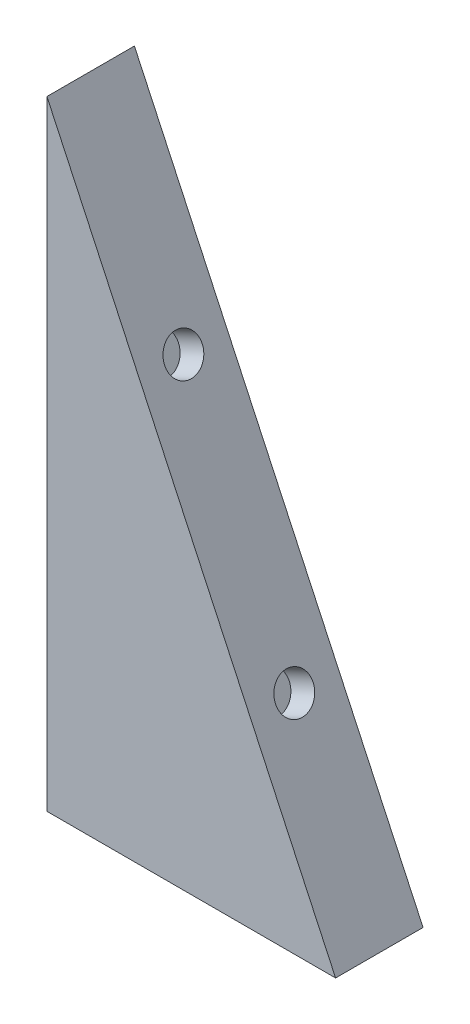
ISO-10303-21;
HEADER;
FILE_DESCRIPTION(('STEP AP214'),'2;1');
FILE_NAME('part.step','',(''),(''),'','','');
FILE_SCHEMA(('AUTOMOTIVE_DESIGN { 1 0 10303 214 1 1 1 1 }'));
ENDSEC;
DATA;
#1=APPLICATION_CONTEXT('core data for automotive mechanical design processes');
#2=APPLICATION_PROTOCOL_DEFINITION('international standard','automotive_design',2000,#1);
#3=PRODUCT_CONTEXT('',#1,'mechanical');
#4=PRODUCT('Part','Part','',(#3));
#5=PRODUCT_RELATED_PRODUCT_CATEGORY('part','',(#4));
#6=PRODUCT_DEFINITION_FORMATION('','',#4);
#7=PRODUCT_DEFINITION_CONTEXT('part definition',#1,'design');
#8=PRODUCT_DEFINITION('design','',#6,#7);
#9=PRODUCT_DEFINITION_SHAPE('','',#8);
#10=(LENGTH_UNIT() NAMED_UNIT(*) SI_UNIT(.MILLI.,.METRE.));
#11=(NAMED_UNIT(*) PLANE_ANGLE_UNIT() SI_UNIT($,.RADIAN.));
#12=(NAMED_UNIT(*) SI_UNIT($,.STERADIAN.) SOLID_ANGLE_UNIT());
#13=UNCERTAINTY_MEASURE_WITH_UNIT(LENGTH_MEASURE(1.E-05),#10,'distance_accuracy_value','');
#14=(GEOMETRIC_REPRESENTATION_CONTEXT(3) GLOBAL_UNCERTAINTY_ASSIGNED_CONTEXT((#13)) GLOBAL_UNIT_ASSIGNED_CONTEXT((#10,
#11,#12)) REPRESENTATION_CONTEXT('',''));
#15=CARTESIAN_POINT('',(0.,0.,0.));
#16=DIRECTION('',(0.,0.,1.));
#17=DIRECTION('',(1.,0.,0.));
#18=AXIS2_PLACEMENT_3D('',#15,#16,#17);
#19=CARTESIAN_POINT('',(0.,0.,10.));
#20=DIRECTION('',(0.,1.,0.));
#21=DIRECTION('',(0.,0.,1.));
#22=AXIS2_PLACEMENT_3D('',#19,#20,#21);
#23=PLANE('',#22);
#24=CARTESIAN_POINT('',(23.331538290775,0.,3.99999999999998));
#25=DIRECTION('',(0.,-1.,0.));
#26=DIRECTION('',(1.,0.,0.));
#27=AXIS2_PLACEMENT_3D('',#24,#25,#26);
#28=CIRCLE('',#27,2.15);
#29=CARTESIAN_POINT('',(25.481538290775,0.,3.99999999999998));
#30=VERTEX_POINT('',#29);
#31=EDGE_CURVE('E346',#30,#30,#28,.T.);
#32=ORIENTED_EDGE('',*,*,#31,.F.);
#33=EDGE_LOOP('',(#32));
#34=FACE_BOUND('',#33,.T.);
#35=CARTESIAN_POINT('',(8.55153829077501,0.,3.99999999999998));
#36=DIRECTION('',(0.,-1.,0.));
#37=DIRECTION('',(1.,0.,0.));
#38=AXIS2_PLACEMENT_3D('',#35,#36,#37);
#39=CIRCLE('',#38,2.15);
#40=CARTESIAN_POINT('',(10.701538290775,0.,3.99999999999998));
#41=VERTEX_POINT('',#40);
#42=EDGE_CURVE('E352',#41,#41,#39,.T.);
#43=ORIENTED_EDGE('',*,*,#42,.F.);
#44=EDGE_LOOP('',(#43));
#45=FACE_BOUND('',#44,.T.);
#46=DIRECTION('',(1.,0.,0.));
#47=VECTOR('',#46,1.);
#48=CARTESIAN_POINT('',(0.,0.,0.));
#49=LINE('',#48,#47);
#50=CARTESIAN_POINT('',(0.,0.,0.));
#51=VERTEX_POINT('',#50);
#52=CARTESIAN_POINT('',(33.,0.,0.));
#53=VERTEX_POINT('',#52);
#54=EDGE_CURVE('E393',#51,#53,#49,.T.);
#55=ORIENTED_EDGE('',*,*,#54,.T.);
#56=DIRECTION('',(0.,0.,-1.));
#57=VECTOR('',#56,1.);
#58=CARTESIAN_POINT('',(33.,0.,10.));
#59=LINE('',#58,#57);
#60=CARTESIAN_POINT('',(33.,0.,10.));
#61=VERTEX_POINT('',#60);
#62=EDGE_CURVE('E397',#61,#53,#59,.T.);
#63=ORIENTED_EDGE('',*,*,#62,.F.);
#64=DIRECTION('',(1.,0.,0.));
#65=VECTOR('',#64,1.);
#66=CARTESIAN_POINT('',(0.,0.,10.));
#67=LINE('',#66,#65);
#68=CARTESIAN_POINT('',(0.,0.,10.));
#69=VERTEX_POINT('',#68);
#70=EDGE_CURVE('E395',#69,#61,#67,.T.);
#71=ORIENTED_EDGE('',*,*,#70,.F.);
#72=DIRECTION('',(0.,0.,-1.));
#73=VECTOR('',#72,1.);
#74=CARTESIAN_POINT('',(0.,0.,10.));
#75=LINE('',#74,#73);
#76=EDGE_CURVE('E43',#69,#51,#75,.T.);
#77=ORIENTED_EDGE('',*,*,#76,.T.);
#78=EDGE_LOOP('',(#55,#63,#71,#77));
#79=FACE_BOUND('',#78,.T.);
#80=DIRECTION('',(0.,0.,1.));
#81=VECTOR('',#80,1.);
#82=CARTESIAN_POINT('',(19.4,0.,6.9));
#83=LINE('',#82,#81);
#84=CARTESIAN_POINT('',(19.4,0.,3.1));
#85=VERTEX_POINT('',#84);
#86=CARTESIAN_POINT('',(19.4,0.,6.9));
#87=VERTEX_POINT('',#86);
#88=EDGE_CURVE('E345',#85,#87,#83,.T.);
#89=ORIENTED_EDGE('',*,*,#88,.F.);
#90=DIRECTION('',(1.,0.,0.));
#91=VECTOR('',#90,1.);
#92=CARTESIAN_POINT('',(13.6,0.,3.1));
#93=LINE('',#92,#91);
#94=CARTESIAN_POINT('',(13.6,0.,3.1));
#95=VERTEX_POINT('',#94);
#96=EDGE_CURVE('E360',#95,#85,#93,.T.);
#97=ORIENTED_EDGE('',*,*,#96,.F.);
#98=DIRECTION('',(0.,0.,-1.));
#99=VECTOR('',#98,1.);
#100=CARTESIAN_POINT('',(13.6,0.,6.9));
#101=LINE('',#100,#99);
#102=CARTESIAN_POINT('',(13.6,0.,6.9));
#103=VERTEX_POINT('',#102);
#104=EDGE_CURVE('E372',#103,#95,#101,.T.);
#105=ORIENTED_EDGE('',*,*,#104,.F.);
#106=DIRECTION('',(-1.,0.,0.));
#107=VECTOR('',#106,1.);
#108=CARTESIAN_POINT('',(13.6,0.,6.9));
#109=LINE('',#108,#107);
#110=EDGE_CURVE('E369',#87,#103,#109,.T.);
#111=ORIENTED_EDGE('',*,*,#110,.F.);
#112=EDGE_LOOP('',(#89,#97,#105,#111));
#113=FACE_BOUND('',#112,.T.);
#114=ADVANCED_FACE('F34',(#34,#45,#79,#113),#23,.F.);
#115=CARTESIAN_POINT('',(33.,0.,10.));
#116=DIRECTION('',(-0.906307787036648,-0.422618261740704,0.));
#117=DIRECTION('',(0.422618261740704,-0.906307787036648,0.));
#118=AXIS2_PLACEMENT_3D('',#115,#116,#117);
#119=PLANE('',#118);
#120=CARTESIAN_POINT('',(23.2797799799638,20.8450791018429,5.));
#121=DIRECTION('',(0.906307787036648,0.422618261740704,0.));
#122=DIRECTION('',(-0.422618261740704,0.906307787036648,0.));
#123=AXIS2_PLACEMENT_3D('',#120,#121,#122);
#124=CIRCLE('',#123,2.15);
#125=CARTESIAN_POINT('',(22.3711507172213,22.7936408439717,5.));
#126=VERTEX_POINT('',#125);
#127=EDGE_CURVE('E299',#126,#126,#124,.T.);
#128=ORIENTED_EDGE('',*,*,#127,.F.);
#129=EDGE_LOOP('',(#128));
#130=FACE_BOUND('',#129,.T.);
#131=CARTESIAN_POINT('',(10.6012321277427,48.0343127129423,5.));
#132=DIRECTION('',(0.906307787036648,0.422618261740704,0.));
#133=DIRECTION('',(-0.422618261740704,0.906307787036648,0.));
#134=AXIS2_PLACEMENT_3D('',#131,#132,#133);
#135=CIRCLE('',#134,2.15);
#136=CARTESIAN_POINT('',(9.69260286500018,49.9828744550711,5.));
#137=VERTEX_POINT('',#136);
#138=EDGE_CURVE('E305',#137,#137,#135,.T.);
#139=ORIENTED_EDGE('',*,*,#138,.F.);
#140=EDGE_LOOP('',(#139));
#141=FACE_BOUND('',#140,.T.);
#142=DIRECTION('',(-0.422618261740704,0.906307787036648,0.));
#143=VECTOR('',#142,1.);
#144=CARTESIAN_POINT('',(33.,0.,0.));
#145=LINE('',#144,#143);
#146=CARTESIAN_POINT('',(0.,70.7687283768145,0.));
#147=VERTEX_POINT('',#146);
#148=EDGE_CURVE('E388',#53,#147,#145,.T.);
#149=ORIENTED_EDGE('',*,*,#148,.T.);
#150=DIRECTION('',(0.,0.,-1.));
#151=VECTOR('',#150,1.);
#152=CARTESIAN_POINT('',(0.,70.7687283768145,10.));
#153=LINE('',#152,#151);
#154=CARTESIAN_POINT('',(0.,70.7687283768145,10.));
#155=VERTEX_POINT('',#154);
#156=EDGE_CURVE('E11',#155,#147,#153,.T.);
#157=ORIENTED_EDGE('',*,*,#156,.F.);
#158=DIRECTION('',(-0.422618261740704,0.906307787036648,0.));
#159=VECTOR('',#158,1.);
#160=CARTESIAN_POINT('',(33.,0.,10.));
#161=LINE('',#160,#159);
#162=EDGE_CURVE('E389',#61,#155,#161,.T.);
#163=ORIENTED_EDGE('',*,*,#162,.F.);
#164=ORIENTED_EDGE('',*,*,#62,.T.);
#165=EDGE_LOOP('',(#149,#157,#163,#164));
#166=FACE_BOUND('',#165,.T.);
#167=ADVANCED_FACE('F36',(#130,#141,#166),#119,.F.);
#168=CARTESIAN_POINT('',(0.,70.7687283768145,10.));
#169=DIRECTION('',(1.,0.,0.));
#170=DIRECTION('',(0.,1.,0.));
#171=AXIS2_PLACEMENT_3D('',#168,#169,#170);
#172=PLANE('',#171);
#173=DIRECTION('',(0.,-1.,0.));
#174=VECTOR('',#173,1.);
#175=CARTESIAN_POINT('',(0.,70.7687283768145,0.));
#176=LINE('',#175,#174);
#177=EDGE_CURVE('E400',#147,#51,#176,.T.);
#178=ORIENTED_EDGE('',*,*,#177,.T.);
#179=ORIENTED_EDGE('',*,*,#76,.F.);
#180=DIRECTION('',(0.,-1.,0.));
#181=VECTOR('',#180,1.);
#182=CARTESIAN_POINT('',(0.,70.7687283768145,10.));
#183=LINE('',#182,#181);
#184=EDGE_CURVE('E392',#155,#69,#183,.T.);
#185=ORIENTED_EDGE('',*,*,#184,.F.);
#186=ORIENTED_EDGE('',*,*,#156,.T.);
#187=EDGE_LOOP('',(#178,#179,#185,#186));
#188=FACE_BOUND('',#187,.T.);
#189=ADVANCED_FACE('F453',(#188),#172,.F.);
#190=CARTESIAN_POINT('',(0.,0.,10.));
#191=DIRECTION('',(0.,0.,-1.));
#192=DIRECTION('',(-1.,0.,0.));
#193=AXIS2_PLACEMENT_3D('',#190,#191,#192);
#194=PLANE('',#193);
#195=ORIENTED_EDGE('',*,*,#162,.T.);
#196=ORIENTED_EDGE('',*,*,#184,.T.);
#197=ORIENTED_EDGE('',*,*,#70,.T.);
#198=EDGE_LOOP('',(#195,#196,#197));
#199=FACE_BOUND('',#198,.T.);
#200=ADVANCED_FACE('F461',(#199),#194,.F.);
#201=CARTESIAN_POINT('',(0.,0.,0.));
#202=DIRECTION('',(0.,0.,-1.));
#203=DIRECTION('',(-1.,0.,0.));
#204=AXIS2_PLACEMENT_3D('',#201,#202,#203);
#205=PLANE('',#204);
#206=DIRECTION('',(-0.430111255691985,0.902775890089597,0.));
#207=VECTOR('',#206,1.);
#208=CARTESIAN_POINT('',(21.6950175173137,10.3361989714915,0.));
#209=LINE('',#208,#207);
#210=CARTESIAN_POINT('',(6.62751953155143,41.9619091232409,0.));
#211=VERTEX_POINT('',#210);
#212=CARTESIAN_POINT('',(3.35867398829233,48.8230058879219,0.));
#213=VERTEX_POINT('',#212);
#214=EDGE_CURVE('E51',#211,#213,#209,.T.);
#215=ORIENTED_EDGE('',*,*,#214,.F.);
#216=DIRECTION('',(-0.902775890089598,-0.430111255691982,0.));
#217=VECTOR('',#216,1.);
#218=CARTESIAN_POINT('',(-15.0674979857622,31.6257101517496,0.));
#219=LINE('',#218,#217);
#220=CARTESIAN_POINT('',(9.51640237983814,43.3382651414553,0.));
#221=VERTEX_POINT('',#220);
#222=EDGE_CURVE('E266',#221,#211,#219,.T.);
#223=ORIENTED_EDGE('',*,*,#222,.F.);
#224=DIRECTION('',(0.430111255691984,-0.902775890089597,0.));
#225=VECTOR('',#224,1.);
#226=CARTESIAN_POINT('',(24.5839003656003,11.7125549897058,0.));
#227=LINE('',#226,#225);
#228=CARTESIAN_POINT('',(6.24755683657904,50.1993619061362,0.));
#229=VERTEX_POINT('',#228);
#230=EDGE_CURVE('E263',#229,#221,#227,.T.);
#231=ORIENTED_EDGE('',*,*,#230,.F.);
#232=DIRECTION('',(0.902775890089598,0.430111255691982,0.));
#233=VECTOR('',#232,1.);
#234=CARTESIAN_POINT('',(-18.3363435290212,38.4868069164305,0.));
#235=LINE('',#234,#233);
#236=EDGE_CURVE('E259',#213,#229,#235,.T.);
#237=ORIENTED_EDGE('',*,*,#236,.F.);
#238=EDGE_LOOP('',(#215,#223,#231,#237));
#239=FACE_BOUND('',#238,.T.);
#240=DIRECTION('',(-0.4150962680394,0.9097774938191,0.));
#241=VECTOR('',#240,1.);
#242=CARTESIAN_POINT('',(21.5006822055188,9.80992935574487,0.));
#243=LINE('',#242,#241);
#244=CARTESIAN_POINT('',(19.2258982592982,14.7956336294728,0.));
#245=VERTEX_POINT('',#244);
#246=CARTESIAN_POINT('',(16.0711666221987,21.7099425824979,0.));
#247=VERTEX_POINT('',#246);
#248=EDGE_CURVE('E59',#245,#247,#243,.T.);
#249=ORIENTED_EDGE('',*,*,#248,.F.);
#250=DIRECTION('',(-0.909777493819097,-0.415096268039407,0.));
#251=VECTOR('',#250,1.);
#252=CARTESIAN_POINT('',(-2.2747839462206,4.98570427372771,0.));
#253=LINE('',#252,#251);
#254=CARTESIAN_POINT('',(22.1371862395193,16.1239416871989,0.));
#255=VERTEX_POINT('',#254);
#256=EDGE_CURVE('E285',#255,#245,#253,.T.);
#257=ORIENTED_EDGE('',*,*,#256,.F.);
#258=DIRECTION('',(0.415096268039401,-0.909777493819099,0.));
#259=VECTOR('',#258,1.);
#260=CARTESIAN_POINT('',(24.4119701857399,11.138237413471,0.));
#261=LINE('',#260,#259);
#262=CARTESIAN_POINT('',(18.9824546024198,23.038250640224,0.));
#263=VERTEX_POINT('',#262);
#264=EDGE_CURVE('E282',#263,#255,#261,.T.);
#265=ORIENTED_EDGE('',*,*,#264,.F.);
#266=DIRECTION('',(0.9097774938191,0.415096268039401,0.));
#267=VECTOR('',#266,1.);
#268=CARTESIAN_POINT('',(-5.42951558332008,11.900013226753,0.));
#269=LINE('',#268,#267);
#270=EDGE_CURVE('E279',#247,#263,#269,.T.);
#271=ORIENTED_EDGE('',*,*,#270,.F.);
#272=EDGE_LOOP('',(#249,#257,#265,#271));
#273=FACE_BOUND('',#272,.T.);
#274=DIRECTION('',(0.,-1.,0.));
#275=VECTOR('',#274,1.);
#276=CARTESIAN_POINT('',(12.351538290775,3.25,0.));
#277=LINE('',#276,#275);
#278=CARTESIAN_POINT('',(12.351538290775,6.75,0.));
#279=VERTEX_POINT('',#278);
#280=CARTESIAN_POINT('',(12.351538290775,3.25,0.));
#281=VERTEX_POINT('',#280);
#282=EDGE_CURVE('E298',#279,#281,#277,.T.);
#283=ORIENTED_EDGE('',*,*,#282,.F.);
#284=DIRECTION('',(1.,0.,0.));
#285=VECTOR('',#284,1.);
#286=CARTESIAN_POINT('',(12.351538290775,6.75,0.));
#287=LINE('',#286,#285);
#288=CARTESIAN_POINT('',(4.75153829077501,6.75,0.));
#289=VERTEX_POINT('',#288);
#290=EDGE_CURVE('E199',#289,#279,#287,.T.);
#291=ORIENTED_EDGE('',*,*,#290,.F.);
#292=DIRECTION('',(0.,1.,0.));
#293=VECTOR('',#292,1.);
#294=CARTESIAN_POINT('',(4.75153829077501,6.75,0.));
#295=LINE('',#294,#293);
#296=CARTESIAN_POINT('',(4.75153829077501,3.25,0.));
#297=VERTEX_POINT('',#296);
#298=EDGE_CURVE('E312',#297,#289,#295,.T.);
#299=ORIENTED_EDGE('',*,*,#298,.F.);
#300=DIRECTION('',(-1.,0.,0.));
#301=VECTOR('',#300,1.);
#302=CARTESIAN_POINT('',(4.75153829077501,3.25,0.));
#303=LINE('',#302,#301);
#304=EDGE_CURVE('E309',#281,#297,#303,.T.);
#305=ORIENTED_EDGE('',*,*,#304,.F.);
#306=EDGE_LOOP('',(#283,#291,#299,#305));
#307=FACE_BOUND('',#306,.T.);
#308=DIRECTION('',(1.,0.,0.));
#309=VECTOR('',#308,1.);
#310=CARTESIAN_POINT('',(0.,6.75000000000001,0.));
#311=LINE('',#310,#309);
#312=CARTESIAN_POINT('',(19.531538290775,6.75,0.));
#313=VERTEX_POINT('',#312);
#314=CARTESIAN_POINT('',(27.131538290775,6.75,0.));
#315=VERTEX_POINT('',#314);
#316=EDGE_CURVE('E320',#313,#315,#311,.T.);
#317=ORIENTED_EDGE('',*,*,#316,.F.);
#318=DIRECTION('',(0.,-1.,0.));
#319=VECTOR('',#318,1.);
#320=CARTESIAN_POINT('',(19.531538290775,0.,0.));
#321=LINE('',#320,#319);
#322=CARTESIAN_POINT('',(19.531538290775,3.25,0.));
#323=VERTEX_POINT('',#322);
#324=EDGE_CURVE('E329',#313,#323,#321,.T.);
#325=ORIENTED_EDGE('',*,*,#324,.T.);
#326=DIRECTION('',(-1.,0.,0.));
#327=VECTOR('',#326,1.);
#328=CARTESIAN_POINT('',(0.,3.25,0.));
#329=LINE('',#328,#327);
#330=CARTESIAN_POINT('',(27.131538290775,3.25,0.));
#331=VERTEX_POINT('',#330);
#332=EDGE_CURVE('E326',#331,#323,#329,.T.);
#333=ORIENTED_EDGE('',*,*,#332,.F.);
#334=DIRECTION('',(0.,-1.,0.));
#335=VECTOR('',#334,1.);
#336=CARTESIAN_POINT('',(27.131538290775,0.,0.));
#337=LINE('',#336,#335);
#338=EDGE_CURVE('E322',#315,#331,#337,.T.);
#339=ORIENTED_EDGE('',*,*,#338,.F.);
#340=EDGE_LOOP('',(#317,#325,#333,#339));
#341=FACE_BOUND('',#340,.T.);
#342=ORIENTED_EDGE('',*,*,#148,.F.);
#343=ORIENTED_EDGE('',*,*,#54,.F.);
#344=ORIENTED_EDGE('',*,*,#177,.F.);
#345=EDGE_LOOP('',(#342,#343,#344));
#346=FACE_BOUND('',#345,.T.);
#347=ADVANCED_FACE('F458',(#239,#273,#307,#341,#346),#205,.T.);
#348=CARTESIAN_POINT('',(19.4,-2.,6.9));
#349=DIRECTION('',(-1.,0.,0.));
#350=DIRECTION('',(0.,-1.,0.));
#351=AXIS2_PLACEMENT_3D('',#348,#349,#350);
#352=PLANE('',#351);
#353=ORIENTED_EDGE('',*,*,#88,.T.);
#354=DIRECTION('',(0.,1.,0.));
#355=VECTOR('',#354,1.);
#356=CARTESIAN_POINT('',(19.4,-2.,6.9));
#357=LINE('',#356,#355);
#358=CARTESIAN_POINT('',(19.4,-2.,6.9));
#359=VERTEX_POINT('',#358);
#360=EDGE_CURVE('E385',#359,#87,#357,.T.);
#361=ORIENTED_EDGE('',*,*,#360,.F.);
#362=DIRECTION('',(0.,0.,1.));
#363=VECTOR('',#362,1.);
#364=CARTESIAN_POINT('',(19.4,-2.,6.9));
#365=LINE('',#364,#363);
#366=CARTESIAN_POINT('',(19.4,-2.,3.1));
#367=VERTEX_POINT('',#366);
#368=EDGE_CURVE('E356',#367,#359,#365,.T.);
#369=ORIENTED_EDGE('',*,*,#368,.F.);
#370=DIRECTION('',(0.,1.,0.));
#371=VECTOR('',#370,1.);
#372=CARTESIAN_POINT('',(19.4,-2.,3.1));
#373=LINE('',#372,#371);
#374=EDGE_CURVE('E366',#367,#85,#373,.T.);
#375=ORIENTED_EDGE('',*,*,#374,.T.);
#376=EDGE_LOOP('',(#353,#361,#369,#375));
#377=FACE_BOUND('',#376,.T.);
#378=ADVANCED_FACE('F479',(#377),#352,.F.);
#379=CARTESIAN_POINT('',(13.6,-2.,6.9));
#380=DIRECTION('',(0.,0.,-1.));
#381=DIRECTION('',(-1.,0.,0.));
#382=AXIS2_PLACEMENT_3D('',#379,#380,#381);
#383=PLANE('',#382);
#384=ORIENTED_EDGE('',*,*,#110,.T.);
#385=DIRECTION('',(0.,1.,0.));
#386=VECTOR('',#385,1.);
#387=CARTESIAN_POINT('',(13.6,-2.,6.9));
#388=LINE('',#387,#386);
#389=CARTESIAN_POINT('',(13.6,-2.,6.9));
#390=VERTEX_POINT('',#389);
#391=EDGE_CURVE('E382',#390,#103,#388,.T.);
#392=ORIENTED_EDGE('',*,*,#391,.F.);
#393=DIRECTION('',(-1.,0.,0.));
#394=VECTOR('',#393,1.);
#395=CARTESIAN_POINT('',(13.6,-2.,6.9));
#396=LINE('',#395,#394);
#397=EDGE_CURVE('E359',#359,#390,#396,.T.);
#398=ORIENTED_EDGE('',*,*,#397,.F.);
#399=ORIENTED_EDGE('',*,*,#360,.T.);
#400=EDGE_LOOP('',(#384,#392,#398,#399));
#401=FACE_BOUND('',#400,.T.);
#402=ADVANCED_FACE('F484',(#401),#383,.F.);
#403=CARTESIAN_POINT('',(13.6,-2.,6.9));
#404=DIRECTION('',(1.,0.,0.));
#405=DIRECTION('',(0.,1.,0.));
#406=AXIS2_PLACEMENT_3D('',#403,#404,#405);
#407=PLANE('',#406);
#408=ORIENTED_EDGE('',*,*,#104,.T.);
#409=DIRECTION('',(0.,1.,0.));
#410=VECTOR('',#409,1.);
#411=CARTESIAN_POINT('',(13.6,-2.,3.1));
#412=LINE('',#411,#410);
#413=CARTESIAN_POINT('',(13.6,-2.,3.1));
#414=VERTEX_POINT('',#413);
#415=EDGE_CURVE('E379',#414,#95,#412,.T.);
#416=ORIENTED_EDGE('',*,*,#415,.F.);
#417=DIRECTION('',(0.,0.,-1.));
#418=VECTOR('',#417,1.);
#419=CARTESIAN_POINT('',(13.6,-2.,6.9));
#420=LINE('',#419,#418);
#421=EDGE_CURVE('E362',#390,#414,#420,.T.);
#422=ORIENTED_EDGE('',*,*,#421,.F.);
#423=ORIENTED_EDGE('',*,*,#391,.T.);
#424=EDGE_LOOP('',(#408,#416,#422,#423));
#425=FACE_BOUND('',#424,.T.);
#426=ADVANCED_FACE('F836',(#425),#407,.F.);
#427=CARTESIAN_POINT('',(13.6,-2.,3.1));
#428=DIRECTION('',(0.,0.,1.));
#429=DIRECTION('',(1.,0.,0.));
#430=AXIS2_PLACEMENT_3D('',#427,#428,#429);
#431=PLANE('',#430);
#432=ORIENTED_EDGE('',*,*,#96,.T.);
#433=ORIENTED_EDGE('',*,*,#374,.F.);
#434=DIRECTION('',(1.,0.,0.));
#435=VECTOR('',#434,1.);
#436=CARTESIAN_POINT('',(13.6,-2.,3.1));
#437=LINE('',#436,#435);
#438=EDGE_CURVE('E364',#414,#367,#437,.T.);
#439=ORIENTED_EDGE('',*,*,#438,.F.);
#440=ORIENTED_EDGE('',*,*,#415,.T.);
#441=EDGE_LOOP('',(#432,#433,#439,#440));
#442=FACE_BOUND('',#441,.T.);
#443=ADVANCED_FACE('F827',(#442),#431,.F.);
#444=CARTESIAN_POINT('',(0.,-2.,0.));
#445=DIRECTION('',(0.,-1.,0.));
#446=DIRECTION('',(1.,0.,0.));
#447=AXIS2_PLACEMENT_3D('',#444,#445,#446);
#448=PLANE('',#447);
#449=ORIENTED_EDGE('',*,*,#368,.T.);
#450=ORIENTED_EDGE('',*,*,#397,.T.);
#451=ORIENTED_EDGE('',*,*,#421,.T.);
#452=ORIENTED_EDGE('',*,*,#438,.T.);
#453=EDGE_LOOP('',(#449,#450,#451,#452));
#454=FACE_BOUND('',#453,.T.);
#455=ADVANCED_FACE('F530',(#454),#448,.T.);
#456=CARTESIAN_POINT('',(8.55153829077501,12.,3.99999999999998));
#457=DIRECTION('',(0.,-1.,0.));
#458=DIRECTION('',(1.,0.,0.));
#459=AXIS2_PLACEMENT_3D('',#456,#457,#458);
#460=CYLINDRICAL_SURFACE('',#459,2.15);
#461=CARTESIAN_POINT('',(8.55153829077501,3.25,3.99999999999998));
#462=DIRECTION('',(0.,-1.,0.));
#463=DIRECTION('',(0.,0.,-1.));
#464=AXIS2_PLACEMENT_3D('',#461,#462,#463);
#465=CIRCLE('',#464,2.15);
#466=CARTESIAN_POINT('',(8.55153829077501,3.25,1.84999999999998));
#467=VERTEX_POINT('',#466);
#468=EDGE_CURVE('E202',#467,#467,#465,.F.);
#469=ORIENTED_EDGE('',*,*,#468,.T.);
#470=EDGE_LOOP('',(#469));
#471=FACE_BOUND('',#470,.T.);
#472=ORIENTED_EDGE('',*,*,#42,.T.);
#473=EDGE_LOOP('',(#472));
#474=FACE_BOUND('',#473,.T.);
#475=ADVANCED_FACE('F522',(#471,#474),#460,.F.);
#476=CARTESIAN_POINT('',(23.331538290775,12.,3.99999999999998));
#477=DIRECTION('',(0.,-1.,0.));
#478=DIRECTION('',(1.,0.,0.));
#479=AXIS2_PLACEMENT_3D('',#476,#477,#478);
#480=CYLINDRICAL_SURFACE('',#479,2.15);
#481=CARTESIAN_POINT('',(23.331538290775,3.25,3.99999999999998));
#482=DIRECTION('',(0.,-1.,0.));
#483=DIRECTION('',(0.,0.,-1.));
#484=AXIS2_PLACEMENT_3D('',#481,#482,#483);
#485=CIRCLE('',#484,2.15);
#486=CARTESIAN_POINT('',(23.331538290775,3.25,1.84999999999998));
#487=VERTEX_POINT('',#486);
#488=EDGE_CURVE('E335',#487,#487,#485,.F.);
#489=ORIENTED_EDGE('',*,*,#488,.T.);
#490=EDGE_LOOP('',(#489));
#491=FACE_BOUND('',#490,.T.);
#492=ORIENTED_EDGE('',*,*,#31,.T.);
#493=EDGE_LOOP('',(#492));
#494=FACE_BOUND('',#493,.T.);
#495=ADVANCED_FACE('F519',(#491,#494),#480,.F.);
#496=CARTESIAN_POINT('',(0.,6.75000000000001,6.5));
#497=DIRECTION('',(0.,1.,0.));
#498=DIRECTION('',(-1.,0.,0.));
#499=AXIS2_PLACEMENT_3D('',#496,#497,#498);
#500=PLANE('',#499);
#501=ORIENTED_EDGE('',*,*,#316,.T.);
#502=DIRECTION('',(0.,0.,-1.));
#503=VECTOR('',#502,1.);
#504=CARTESIAN_POINT('',(27.131538290775,6.75,6.5));
#505=LINE('',#504,#503);
#506=CARTESIAN_POINT('',(27.131538290775,6.75,8.75));
#507=VERTEX_POINT('',#506);
#508=EDGE_CURVE('E332',#507,#315,#505,.T.);
#509=ORIENTED_EDGE('',*,*,#508,.F.);
#510=DIRECTION('',(1.,0.,0.));
#511=VECTOR('',#510,1.);
#512=CARTESIAN_POINT('',(27.131538290775,6.75,8.75));
#513=LINE('',#512,#511);
#514=CARTESIAN_POINT('',(19.531538290775,6.75,8.75));
#515=VERTEX_POINT('',#514);
#516=EDGE_CURVE('E255',#515,#507,#513,.T.);
#517=ORIENTED_EDGE('',*,*,#516,.F.);
#518=DIRECTION('',(0.,0.,-1.));
#519=VECTOR('',#518,1.);
#520=CARTESIAN_POINT('',(19.531538290775,6.75,6.5));
#521=LINE('',#520,#519);
#522=EDGE_CURVE('E333',#515,#313,#521,.T.);
#523=ORIENTED_EDGE('',*,*,#522,.T.);
#524=EDGE_LOOP('',(#501,#509,#517,#523));
#525=FACE_BOUND('',#524,.T.);
#526=CARTESIAN_POINT('',(23.331538290775,6.75,3.99999999999998));
#527=DIRECTION('',(0.,1.,0.));
#528=DIRECTION('',(-1.,0.,0.));
#529=AXIS2_PLACEMENT_3D('',#526,#527,#528);
#530=CIRCLE('',#529,2.15);
#531=CARTESIAN_POINT('',(21.181538290775,6.75,3.99999999999998));
#532=VERTEX_POINT('',#531);
#533=EDGE_CURVE('E355',#532,#532,#530,.F.);
#534=ORIENTED_EDGE('',*,*,#533,.F.);
#535=EDGE_LOOP('',(#534));
#536=FACE_BOUND('',#535,.T.);
#537=ADVANCED_FACE('F500',(#525,#536),#500,.F.);
#538=CARTESIAN_POINT('',(0.,3.25,6.5));
#539=DIRECTION('',(0.,-1.,0.));
#540=DIRECTION('',(0.,0.,-1.));
#541=AXIS2_PLACEMENT_3D('',#538,#539,#540);
#542=PLANE('',#541);
#543=ORIENTED_EDGE('',*,*,#332,.T.);
#544=DIRECTION('',(0.,0.,-1.));
#545=VECTOR('',#544,1.);
#546=CARTESIAN_POINT('',(19.531538290775,3.25,6.5));
#547=LINE('',#546,#545);
#548=CARTESIAN_POINT('',(19.531538290775,3.25,8.75));
#549=VERTEX_POINT('',#548);
#550=EDGE_CURVE('E336',#549,#323,#547,.T.);
#551=ORIENTED_EDGE('',*,*,#550,.F.);
#552=DIRECTION('',(-1.,0.,0.));
#553=VECTOR('',#552,1.);
#554=CARTESIAN_POINT('',(19.531538290775,3.25,8.75));
#555=LINE('',#554,#553);
#556=CARTESIAN_POINT('',(27.131538290775,3.25,8.75));
#557=VERTEX_POINT('',#556);
#558=EDGE_CURVE('E249',#557,#549,#555,.T.);
#559=ORIENTED_EDGE('',*,*,#558,.F.);
#560=DIRECTION('',(0.,0.,-1.));
#561=VECTOR('',#560,1.);
#562=CARTESIAN_POINT('',(27.131538290775,3.25,6.5));
#563=LINE('',#562,#561);
#564=EDGE_CURVE('E338',#557,#331,#563,.T.);
#565=ORIENTED_EDGE('',*,*,#564,.T.);
#566=EDGE_LOOP('',(#543,#551,#559,#565));
#567=FACE_BOUND('',#566,.T.);
#568=ORIENTED_EDGE('',*,*,#488,.F.);
#569=EDGE_LOOP('',(#568));
#570=FACE_BOUND('',#569,.T.);
#571=ADVANCED_FACE('F513',(#567,#570),#542,.F.);
#572=CARTESIAN_POINT('',(19.531538290775,0.,6.5));
#573=DIRECTION('',(1.,0.,0.));
#574=DIRECTION('',(0.,0.,-1.));
#575=AXIS2_PLACEMENT_3D('',#572,#573,#574);
#576=PLANE('',#575);
#577=ORIENTED_EDGE('',*,*,#324,.F.);
#578=ORIENTED_EDGE('',*,*,#522,.F.);
#579=DIRECTION('',(0.,1.,0.));
#580=VECTOR('',#579,1.);
#581=CARTESIAN_POINT('',(19.531538290775,6.75,8.75));
#582=LINE('',#581,#580);
#583=EDGE_CURVE('E252',#549,#515,#582,.T.);
#584=ORIENTED_EDGE('',*,*,#583,.F.);
#585=ORIENTED_EDGE('',*,*,#550,.T.);
#586=EDGE_LOOP('',(#577,#578,#584,#585));
#587=FACE_BOUND('',#586,.T.);
#588=ADVANCED_FACE('F511',(#587),#576,.T.);
#589=CARTESIAN_POINT('',(27.131538290775,0.,6.5));
#590=DIRECTION('',(1.,0.,0.));
#591=DIRECTION('',(0.,0.,-1.));
#592=AXIS2_PLACEMENT_3D('',#589,#590,#591);
#593=PLANE('',#592);
#594=ORIENTED_EDGE('',*,*,#338,.T.);
#595=ORIENTED_EDGE('',*,*,#564,.F.);
#596=DIRECTION('',(0.,-1.,0.));
#597=VECTOR('',#596,1.);
#598=CARTESIAN_POINT('',(27.131538290775,3.25,8.75));
#599=LINE('',#598,#597);
#600=EDGE_CURVE('E226',#507,#557,#599,.T.);
#601=ORIENTED_EDGE('',*,*,#600,.F.);
#602=ORIENTED_EDGE('',*,*,#508,.T.);
#603=EDGE_LOOP('',(#594,#595,#601,#602));
#604=FACE_BOUND('',#603,.T.);
#605=ADVANCED_FACE('F505',(#604),#593,.F.);
#606=CARTESIAN_POINT('',(23.331538290775,12.,3.99999999999998));
#607=DIRECTION('',(0.,-1.,0.));
#608=DIRECTION('',(1.,0.,0.));
#609=AXIS2_PLACEMENT_3D('',#606,#607,#608);
#610=PLANE('',#609);
#611=CARTESIAN_POINT('',(23.331538290775,12.,3.99999999999998));
#612=DIRECTION('',(0.,-1.,0.));
#613=DIRECTION('',(1.,0.,0.));
#614=AXIS2_PLACEMENT_3D('',#611,#612,#613);
#615=CIRCLE('',#614,2.15);
#616=CARTESIAN_POINT('',(25.481538290775,12.,3.99999999999998));
#617=VERTEX_POINT('',#616);
#618=EDGE_CURVE('E342',#617,#617,#615,.T.);
#619=ORIENTED_EDGE('',*,*,#618,.T.);
#620=EDGE_LOOP('',(#619));
#621=FACE_BOUND('',#620,.T.);
#622=ADVANCED_FACE('F537',(#621),#610,.T.);
#623=ORIENTED_EDGE('',*,*,#533,.T.);
#624=EDGE_LOOP('',(#623));
#625=FACE_BOUND('',#624,.T.);
#626=ORIENTED_EDGE('',*,*,#618,.F.);
#627=EDGE_LOOP('',(#626));
#628=FACE_BOUND('',#627,.T.);
#629=ADVANCED_FACE('F524',(#625,#628),#480,.F.);
#630=CARTESIAN_POINT('',(12.351538290775,6.75,6.5));
#631=DIRECTION('',(0.,1.,0.));
#632=DIRECTION('',(-1.,0.,0.));
#633=AXIS2_PLACEMENT_3D('',#630,#631,#632);
#634=PLANE('',#633);
#635=ORIENTED_EDGE('',*,*,#290,.T.);
#636=DIRECTION('',(0.,0.,-1.));
#637=VECTOR('',#636,1.);
#638=CARTESIAN_POINT('',(12.351538290775,6.75,6.5));
#639=LINE('',#638,#637);
#640=CARTESIAN_POINT('',(12.351538290775,6.75,8.75));
#641=VERTEX_POINT('',#640);
#642=EDGE_CURVE('E191',#641,#279,#639,.T.);
#643=ORIENTED_EDGE('',*,*,#642,.F.);
#644=DIRECTION('',(1.,0.,0.));
#645=VECTOR('',#644,1.);
#646=CARTESIAN_POINT('',(4.75153829077501,6.75,8.75));
#647=LINE('',#646,#645);
#648=CARTESIAN_POINT('',(4.75153829077501,6.75,8.75));
#649=VERTEX_POINT('',#648);
#650=EDGE_CURVE('E196',#649,#641,#647,.T.);
#651=ORIENTED_EDGE('',*,*,#650,.F.);
#652=DIRECTION('',(0.,0.,-1.));
#653=VECTOR('',#652,1.);
#654=CARTESIAN_POINT('',(4.75153829077501,6.75,6.5));
#655=LINE('',#654,#653);
#656=EDGE_CURVE('E203',#649,#289,#655,.T.);
#657=ORIENTED_EDGE('',*,*,#656,.T.);
#658=EDGE_LOOP('',(#635,#643,#651,#657));
#659=FACE_BOUND('',#658,.T.);
#660=CARTESIAN_POINT('',(8.55153829077501,6.75,3.99999999999998));
#661=DIRECTION('',(0.,1.,0.));
#662=DIRECTION('',(-1.,0.,0.));
#663=AXIS2_PLACEMENT_3D('',#660,#661,#662);
#664=CIRCLE('',#663,2.15);
#665=CARTESIAN_POINT('',(6.40153829077501,6.75,3.99999999999998));
#666=VERTEX_POINT('',#665);
#667=EDGE_CURVE('E323',#666,#666,#664,.F.);
#668=ORIENTED_EDGE('',*,*,#667,.F.);
#669=EDGE_LOOP('',(#668));
#670=FACE_BOUND('',#669,.T.);
#671=ADVANCED_FACE('F193',(#659,#670),#634,.F.);
#672=CARTESIAN_POINT('',(4.75153829077501,3.25,6.5));
#673=DIRECTION('',(0.,-1.,0.));
#674=DIRECTION('',(0.,0.,-1.));
#675=AXIS2_PLACEMENT_3D('',#672,#673,#674);
#676=PLANE('',#675);
#677=ORIENTED_EDGE('',*,*,#304,.T.);
#678=DIRECTION('',(0.,0.,-1.));
#679=VECTOR('',#678,1.);
#680=CARTESIAN_POINT('',(4.75153829077501,3.25,6.5));
#681=LINE('',#680,#679);
#682=CARTESIAN_POINT('',(4.75153829077501,3.25,8.75));
#683=VERTEX_POINT('',#682);
#684=EDGE_CURVE('E317',#683,#297,#681,.T.);
#685=ORIENTED_EDGE('',*,*,#684,.F.);
#686=DIRECTION('',(-1.,0.,0.));
#687=VECTOR('',#686,1.);
#688=CARTESIAN_POINT('',(12.351538290775,3.25,8.75));
#689=LINE('',#688,#687);
#690=CARTESIAN_POINT('',(12.351538290775,3.25,8.75));
#691=VERTEX_POINT('',#690);
#692=EDGE_CURVE('E213',#691,#683,#689,.T.);
#693=ORIENTED_EDGE('',*,*,#692,.F.);
#694=DIRECTION('',(0.,0.,-1.));
#695=VECTOR('',#694,1.);
#696=CARTESIAN_POINT('',(12.351538290775,3.25,6.5));
#697=LINE('',#696,#695);
#698=EDGE_CURVE('E209',#691,#281,#697,.T.);
#699=ORIENTED_EDGE('',*,*,#698,.T.);
#700=EDGE_LOOP('',(#677,#685,#693,#699));
#701=FACE_BOUND('',#700,.T.);
#702=ORIENTED_EDGE('',*,*,#468,.F.);
#703=EDGE_LOOP('',(#702));
#704=FACE_BOUND('',#703,.T.);
#705=ADVANCED_FACE('F543',(#701,#704),#676,.F.);
#706=CARTESIAN_POINT('',(12.351538290775,3.25,6.5));
#707=DIRECTION('',(1.,0.,0.));
#708=DIRECTION('',(0.,0.,-1.));
#709=AXIS2_PLACEMENT_3D('',#706,#707,#708);
#710=PLANE('',#709);
#711=ORIENTED_EDGE('',*,*,#282,.T.);
#712=ORIENTED_EDGE('',*,*,#698,.F.);
#713=DIRECTION('',(0.,-1.,0.));
#714=VECTOR('',#713,1.);
#715=CARTESIAN_POINT('',(12.351538290775,6.75,8.75));
#716=LINE('',#715,#714);
#717=EDGE_CURVE('E206',#641,#691,#716,.T.);
#718=ORIENTED_EDGE('',*,*,#717,.F.);
#719=ORIENTED_EDGE('',*,*,#642,.T.);
#720=EDGE_LOOP('',(#711,#712,#718,#719));
#721=FACE_BOUND('',#720,.T.);
#722=ADVANCED_FACE('F207',(#721),#710,.F.);
#723=CARTESIAN_POINT('',(4.75153829077501,6.75,6.5));
#724=DIRECTION('',(-1.,0.,0.));
#725=DIRECTION('',(0.,0.,1.));
#726=AXIS2_PLACEMENT_3D('',#723,#724,#725);
#727=PLANE('',#726);
#728=ORIENTED_EDGE('',*,*,#298,.T.);
#729=ORIENTED_EDGE('',*,*,#656,.F.);
#730=DIRECTION('',(0.,1.,0.));
#731=VECTOR('',#730,1.);
#732=CARTESIAN_POINT('',(4.75153829077501,3.25,8.75));
#733=LINE('',#732,#731);
#734=EDGE_CURVE('E217',#683,#649,#733,.T.);
#735=ORIENTED_EDGE('',*,*,#734,.F.);
#736=ORIENTED_EDGE('',*,*,#684,.T.);
#737=EDGE_LOOP('',(#728,#729,#735,#736));
#738=FACE_BOUND('',#737,.T.);
#739=ADVANCED_FACE('F558',(#738),#727,.F.);
#740=CARTESIAN_POINT('',(8.55153829077501,12.,3.99999999999998));
#741=DIRECTION('',(0.,-1.,0.));
#742=DIRECTION('',(1.,0.,0.));
#743=AXIS2_PLACEMENT_3D('',#740,#741,#742);
#744=PLANE('',#743);
#745=CARTESIAN_POINT('',(8.55153829077501,12.,3.99999999999998));
#746=DIRECTION('',(0.,-1.,0.));
#747=DIRECTION('',(1.,0.,0.));
#748=AXIS2_PLACEMENT_3D('',#745,#746,#747);
#749=CIRCLE('',#748,2.15);
#750=CARTESIAN_POINT('',(10.701538290775,12.,3.99999999999998));
#751=VERTEX_POINT('',#750);
#752=EDGE_CURVE('E349',#751,#751,#749,.T.);
#753=ORIENTED_EDGE('',*,*,#752,.T.);
#754=EDGE_LOOP('',(#753));
#755=FACE_BOUND('',#754,.T.);
#756=ADVANCED_FACE('F563',(#755),#744,.T.);
#757=ORIENTED_EDGE('',*,*,#667,.T.);
#758=EDGE_LOOP('',(#757));
#759=FACE_BOUND('',#758,.T.);
#760=ORIENTED_EDGE('',*,*,#752,.F.);
#761=EDGE_LOOP('',(#760));
#762=FACE_BOUND('',#761,.T.);
#763=ADVANCED_FACE('F533',(#759,#762),#460,.F.);
#764=CARTESIAN_POINT('',(3.98518528237516,44.9491994022352,5.));
#765=DIRECTION('',(0.906307787036648,0.422618261740704,0.));
#766=DIRECTION('',(-0.422618261740704,0.906307787036648,0.));
#767=AXIS2_PLACEMENT_3D('',#764,#765,#766);
#768=CYLINDRICAL_SURFACE('',#767,2.15);
#769=CARTESIAN_POINT('',(7.88295771623672,46.7667605378903,5.));
#770=DIRECTION('',(0.902775890089597,0.430111255691984,0.));
#771=DIRECTION('',(0.430111255691984,-0.902775890089597,0.));
#772=AXIS2_PLACEMENT_3D('',#769,#770,#771);
#773=ELLIPSE('',#772,2.15007376822944,2.15);
#774=CARTESIAN_POINT('',(8.80772864452028,44.8257257780187,5.));
#775=VERTEX_POINT('',#774);
#776=EDGE_CURVE('E419',#775,#775,#773,.F.);
#777=ORIENTED_EDGE('',*,*,#776,.T.);
#778=EDGE_LOOP('',(#777));
#779=FACE_BOUND('',#778,.T.);
#780=ORIENTED_EDGE('',*,*,#138,.T.);
#781=EDGE_LOOP('',(#780));
#782=FACE_BOUND('',#781,.T.);
#783=ADVANCED_FACE('F566',(#779,#782),#768,.F.);
#784=CARTESIAN_POINT('',(16.6637331345963,17.7599657911358,5.));
#785=DIRECTION('',(0.906307787036648,0.422618261740704,0.));
#786=DIRECTION('',(-0.422618261740704,0.906307787036648,0.));
#787=AXIS2_PLACEMENT_3D('',#784,#785,#786);
#788=CYLINDRICAL_SURFACE('',#787,2.15);
#789=CARTESIAN_POINT('',(20.5614588627006,19.5775051475386,5.));
#790=DIRECTION('',(0.909777493819099,0.415096268039401,0.));
#791=DIRECTION('',(-0.415096268039401,0.909777493819099,0.));
#792=AXIS2_PLACEMENT_3D('',#789,#790,#791);
#793=ELLIPSE('',#792,2.15007376822944,2.15);
#794=CARTESIAN_POINT('',(19.6689712654991,21.5335938719246,5.));
#795=VERTEX_POINT('',#794);
#796=EDGE_CURVE('E272',#795,#795,#793,.F.);
#797=ORIENTED_EDGE('',*,*,#796,.T.);
#798=EDGE_LOOP('',(#797));
#799=FACE_BOUND('',#798,.T.);
#800=ORIENTED_EDGE('',*,*,#127,.T.);
#801=EDGE_LOOP('',(#800));
#802=FACE_BOUND('',#801,.T.);
#803=ADVANCED_FACE('F444',(#799,#802),#788,.F.);
#804=CARTESIAN_POINT('',(21.5006822055188,9.80992935574487,7.5));
#805=DIRECTION('',(-0.9097774938191,-0.4150962680394,0.));
#806=DIRECTION('',(0.4150962680394,-0.9097774938191,0.));
#807=AXIS2_PLACEMENT_3D('',#804,#805,#806);
#808=PLANE('',#807);
#809=ORIENTED_EDGE('',*,*,#248,.T.);
#810=DIRECTION('',(0.,0.,-1.));
#811=VECTOR('',#810,1.);
#812=CARTESIAN_POINT('',(16.0711666221987,21.7099425824979,7.5));
#813=LINE('',#812,#811);
#814=CARTESIAN_POINT('',(16.0711666221987,21.7099425824979,8.75));
#815=VERTEX_POINT('',#814);
#816=EDGE_CURVE('E288',#815,#247,#813,.T.);
#817=ORIENTED_EDGE('',*,*,#816,.F.);
#818=DIRECTION('',(-0.4150962680394,0.9097774938191,0.));
#819=VECTOR('',#818,1.);
#820=CARTESIAN_POINT('',(19.2258982592982,14.7956336294728,8.75));
#821=LINE('',#820,#819);
#822=CARTESIAN_POINT('',(19.2258982592982,14.7956336294728,8.75));
#823=VERTEX_POINT('',#822);
#824=EDGE_CURVE('E221',#823,#815,#821,.T.);
#825=ORIENTED_EDGE('',*,*,#824,.F.);
#826=DIRECTION('',(0.,0.,-1.));
#827=VECTOR('',#826,1.);
#828=CARTESIAN_POINT('',(19.2258982592982,14.7956336294728,7.5));
#829=LINE('',#828,#827);
#830=EDGE_CURVE('E260',#823,#245,#829,.T.);
#831=ORIENTED_EDGE('',*,*,#830,.T.);
#832=EDGE_LOOP('',(#809,#817,#825,#831));
#833=FACE_BOUND('',#832,.T.);
#834=CARTESIAN_POINT('',(17.6611744365059,18.2250803087763,5.));
#835=DIRECTION('',(-0.9097774938191,-0.4150962680394,0.));
#836=DIRECTION('',(-0.4150962680394,0.9097774938191,0.));
#837=AXIS2_PLACEMENT_3D('',#834,#835,#836);
#838=ELLIPSE('',#837,2.15007376822944,2.15);
#839=CARTESIAN_POINT('',(16.7686868393044,20.1811690331623,5.));
#840=VERTEX_POINT('',#839);
#841=EDGE_CURVE('E417',#840,#840,#838,.F.);
#842=ORIENTED_EDGE('',*,*,#841,.F.);
#843=EDGE_LOOP('',(#842));
#844=FACE_BOUND('',#843,.T.);
#845=ADVANCED_FACE('F575',(#833,#844),#808,.F.);
#846=CARTESIAN_POINT('',(24.4119701857399,11.138237413471,7.5));
#847=DIRECTION('',(0.909777493819099,0.415096268039401,0.));
#848=DIRECTION('',(-0.415096268039401,0.909777493819099,0.));
#849=AXIS2_PLACEMENT_3D('',#846,#847,#848);
#850=PLANE('',#849);
#851=ORIENTED_EDGE('',*,*,#264,.T.);
#852=DIRECTION('',(0.,0.,-1.));
#853=VECTOR('',#852,1.);
#854=CARTESIAN_POINT('',(22.1371862395193,16.1239416871989,7.5));
#855=LINE('',#854,#853);
#856=CARTESIAN_POINT('',(22.1371862395193,16.1239416871989,8.75));
#857=VERTEX_POINT('',#856);
#858=EDGE_CURVE('E290',#857,#255,#855,.T.);
#859=ORIENTED_EDGE('',*,*,#858,.F.);
#860=DIRECTION('',(0.415096268039402,-0.909777493819099,0.));
#861=VECTOR('',#860,1.);
#862=CARTESIAN_POINT('',(18.9824546024198,23.038250640224,8.75));
#863=LINE('',#862,#861);
#864=CARTESIAN_POINT('',(18.9824546024198,23.038250640224,8.75));
#865=VERTEX_POINT('',#864);
#866=EDGE_CURVE('E227',#865,#857,#863,.T.);
#867=ORIENTED_EDGE('',*,*,#866,.F.);
#868=DIRECTION('',(0.,0.,-1.));
#869=VECTOR('',#868,1.);
#870=CARTESIAN_POINT('',(18.9824546024198,23.038250640224,7.5));
#871=LINE('',#870,#869);
#872=EDGE_CURVE('E292',#865,#263,#871,.T.);
#873=ORIENTED_EDGE('',*,*,#872,.T.);
#874=EDGE_LOOP('',(#851,#859,#867,#873));
#875=FACE_BOUND('',#874,.T.);
#876=ORIENTED_EDGE('',*,*,#796,.F.);
#877=EDGE_LOOP('',(#876));
#878=FACE_BOUND('',#877,.T.);
#879=ADVANCED_FACE('F583',(#875,#878),#850,.F.);
#880=CARTESIAN_POINT('',(-2.2747839462206,4.98570427372771,7.5));
#881=DIRECTION('',(0.415096268039407,-0.909777493819097,0.));
#882=DIRECTION('',(0.909777493819097,0.415096268039407,0.));
#883=AXIS2_PLACEMENT_3D('',#880,#881,#882);
#884=PLANE('',#883);
#885=ORIENTED_EDGE('',*,*,#256,.T.);
#886=ORIENTED_EDGE('',*,*,#830,.F.);
#887=DIRECTION('',(-0.909777493819097,-0.415096268039407,0.));
#888=VECTOR('',#887,1.);
#889=CARTESIAN_POINT('',(22.1371862395193,16.1239416871989,8.75));
#890=LINE('',#889,#888);
#891=EDGE_CURVE('E230',#857,#823,#890,.T.);
#892=ORIENTED_EDGE('',*,*,#891,.F.);
#893=ORIENTED_EDGE('',*,*,#858,.T.);
#894=EDGE_LOOP('',(#885,#886,#892,#893));
#895=FACE_BOUND('',#894,.T.);
#896=ADVANCED_FACE('F586',(#895),#884,.F.);
#897=CARTESIAN_POINT('',(-5.42951558332008,11.900013226753,7.5));
#898=DIRECTION('',(-0.4150962680394,0.9097774938191,0.));
#899=DIRECTION('',(-0.9097774938191,-0.4150962680394,0.));
#900=AXIS2_PLACEMENT_3D('',#897,#898,#899);
#901=PLANE('',#900);
#902=ORIENTED_EDGE('',*,*,#270,.T.);
#903=ORIENTED_EDGE('',*,*,#872,.F.);
#904=DIRECTION('',(0.909777493819099,0.415096268039402,0.));
#905=VECTOR('',#904,1.);
#906=CARTESIAN_POINT('',(16.0711666221987,21.7099425824979,8.75));
#907=LINE('',#906,#905);
#908=EDGE_CURVE('E218',#815,#865,#907,.T.);
#909=ORIENTED_EDGE('',*,*,#908,.F.);
#910=ORIENTED_EDGE('',*,*,#816,.T.);
#911=EDGE_LOOP('',(#902,#903,#909,#910));
#912=FACE_BOUND('',#911,.T.);
#913=ADVANCED_FACE('F579',(#912),#901,.F.);
#914=CARTESIAN_POINT('',(16.6637331345963,17.7599657911358,5.));
#915=DIRECTION('',(0.906307787036648,0.422618261740704,0.));
#916=DIRECTION('',(-0.422618261740704,0.906307787036648,0.));
#917=AXIS2_PLACEMENT_3D('',#914,#915,#916);
#918=PLANE('',#917);
#919=CARTESIAN_POINT('',(16.6637331345963,17.7599657911358,5.));
#920=DIRECTION('',(0.906307787036648,0.422618261740704,0.));
#921=DIRECTION('',(-0.422618261740704,0.906307787036648,0.));
#922=AXIS2_PLACEMENT_3D('',#919,#920,#921);
#923=CIRCLE('',#922,2.15);
#924=CARTESIAN_POINT('',(15.7551038718538,19.7085275332646,5.));
#925=VERTEX_POINT('',#924);
#926=EDGE_CURVE('E295',#925,#925,#923,.T.);
#927=ORIENTED_EDGE('',*,*,#926,.T.);
#928=EDGE_LOOP('',(#927));
#929=FACE_BOUND('',#928,.T.);
#930=ADVANCED_FACE('F441',(#929),#918,.T.);
#931=ORIENTED_EDGE('',*,*,#841,.T.);
#932=EDGE_LOOP('',(#931));
#933=FACE_BOUND('',#932,.T.);
#934=ORIENTED_EDGE('',*,*,#926,.F.);
#935=EDGE_LOOP('',(#934));
#936=FACE_BOUND('',#935,.T.);
#937=ADVANCED_FACE('F432',(#933,#936),#788,.F.);
#938=CARTESIAN_POINT('',(21.6950175173137,10.3361989714915,7.5));
#939=DIRECTION('',(-0.902775890089597,-0.430111255691985,0.));
#940=DIRECTION('',(0.430111255691985,-0.902775890089597,0.));
#941=AXIS2_PLACEMENT_3D('',#938,#939,#940);
#942=PLANE('',#941);
#943=ORIENTED_EDGE('',*,*,#214,.T.);
#944=DIRECTION('',(0.,0.,-1.));
#945=VECTOR('',#944,1.);
#946=CARTESIAN_POINT('',(3.35867398829233,48.8230058879219,7.5));
#947=LINE('',#946,#945);
#948=CARTESIAN_POINT('',(3.35867398829233,48.8230058879219,8.75));
#949=VERTEX_POINT('',#948);
#950=EDGE_CURVE('E269',#949,#213,#947,.T.);
#951=ORIENTED_EDGE('',*,*,#950,.F.);
#952=DIRECTION('',(-0.430111255691986,0.902775890089597,0.));
#953=VECTOR('',#952,1.);
#954=CARTESIAN_POINT('',(6.62751953155143,41.9619091232409,8.75));
#955=LINE('',#954,#953);
#956=CARTESIAN_POINT('',(6.62751953155143,41.9619091232409,8.75));
#957=VERTEX_POINT('',#956);
#958=EDGE_CURVE('E242',#957,#949,#955,.T.);
#959=ORIENTED_EDGE('',*,*,#958,.F.);
#960=DIRECTION('',(0.,0.,-1.));
#961=VECTOR('',#960,1.);
#962=CARTESIAN_POINT('',(6.62751953155143,41.9619091232409,7.5));
#963=LINE('',#962,#961);
#964=EDGE_CURVE('E270',#957,#211,#963,.T.);
#965=ORIENTED_EDGE('',*,*,#964,.T.);
#966=EDGE_LOOP('',(#943,#951,#959,#965));
#967=FACE_BOUND('',#966,.T.);
#968=CARTESIAN_POINT('',(4.98267329004202,45.414335699128,5.));
#969=DIRECTION('',(-0.902775890089597,-0.430111255691985,0.));
#970=DIRECTION('',(0.430111255691985,-0.902775890089597,0.));
#971=AXIS2_PLACEMENT_3D('',#968,#969,#970);
#972=ELLIPSE('',#971,2.15007376822944,2.15);
#973=CARTESIAN_POINT('',(5.90744421832558,43.4733009392564,5.));
#974=VERTEX_POINT('',#973);
#975=EDGE_CURVE('E38',#974,#974,#972,.F.);
#976=ORIENTED_EDGE('',*,*,#975,.F.);
#977=EDGE_LOOP('',(#976));
#978=FACE_BOUND('',#977,.T.);
#979=ADVANCED_FACE('F429',(#967,#978),#942,.F.);
#980=CARTESIAN_POINT('',(24.5839003656003,11.7125549897058,7.5));
#981=DIRECTION('',(0.902775890089597,0.430111255691984,0.));
#982=DIRECTION('',(-0.430111255691984,0.902775890089597,0.));
#983=AXIS2_PLACEMENT_3D('',#980,#981,#982);
#984=PLANE('',#983);
#985=ORIENTED_EDGE('',*,*,#230,.T.);
#986=DIRECTION('',(0.,0.,-1.));
#987=VECTOR('',#986,1.);
#988=CARTESIAN_POINT('',(9.51640237983814,43.3382651414553,7.5));
#989=LINE('',#988,#987);
#990=CARTESIAN_POINT('',(9.51640237983814,43.3382651414553,8.75));
#991=VERTEX_POINT('',#990);
#992=EDGE_CURVE('E273',#991,#221,#989,.T.);
#993=ORIENTED_EDGE('',*,*,#992,.F.);
#994=DIRECTION('',(0.430111255691986,-0.902775890089596,0.));
#995=VECTOR('',#994,1.);
#996=CARTESIAN_POINT('',(6.24755683657904,50.1993619061362,8.75));
#997=LINE('',#996,#995);
#998=CARTESIAN_POINT('',(6.24755683657904,50.1993619061362,8.75));
#999=VERTEX_POINT('',#998);
#1000=EDGE_CURVE('E236',#999,#991,#997,.T.);
#1001=ORIENTED_EDGE('',*,*,#1000,.F.);
#1002=DIRECTION('',(0.,0.,-1.));
#1003=VECTOR('',#1002,1.);
#1004=CARTESIAN_POINT('',(6.24755683657904,50.1993619061362,7.5));
#1005=LINE('',#1004,#1003);
#1006=EDGE_CURVE('E275',#999,#229,#1005,.T.);
#1007=ORIENTED_EDGE('',*,*,#1006,.T.);
#1008=EDGE_LOOP('',(#985,#993,#1001,#1007));
#1009=FACE_BOUND('',#1008,.T.);
#1010=ORIENTED_EDGE('',*,*,#776,.F.);
#1011=EDGE_LOOP('',(#1010));
#1012=FACE_BOUND('',#1011,.T.);
#1013=ADVANCED_FACE('F431',(#1009,#1012),#984,.F.);
#1014=CARTESIAN_POINT('',(-15.0674979857622,31.6257101517496,7.5));
#1015=DIRECTION('',(0.430111255691982,-0.902775890089598,0.));
#1016=DIRECTION('',(0.902775890089598,0.430111255691982,0.));
#1017=AXIS2_PLACEMENT_3D('',#1014,#1015,#1016);
#1018=PLANE('',#1017);
#1019=ORIENTED_EDGE('',*,*,#222,.T.);
#1020=ORIENTED_EDGE('',*,*,#964,.F.);
#1021=DIRECTION('',(-0.902775890089598,-0.430111255691982,0.));
#1022=VECTOR('',#1021,1.);
#1023=CARTESIAN_POINT('',(9.51640237983814,43.3382651414553,8.75));
#1024=LINE('',#1023,#1022);
#1025=EDGE_CURVE('E239',#991,#957,#1024,.T.);
#1026=ORIENTED_EDGE('',*,*,#1025,.F.);
#1027=ORIENTED_EDGE('',*,*,#992,.T.);
#1028=EDGE_LOOP('',(#1019,#1020,#1026,#1027));
#1029=FACE_BOUND('',#1028,.T.);
#1030=ADVANCED_FACE('F438',(#1029),#1018,.F.);
#1031=CARTESIAN_POINT('',(-18.3363435290212,38.4868069164305,7.5));
#1032=DIRECTION('',(-0.430111255691982,0.902775890089598,0.));
#1033=DIRECTION('',(-0.902775890089598,-0.430111255691982,0.));
#1034=AXIS2_PLACEMENT_3D('',#1031,#1032,#1033);
#1035=PLANE('',#1034);
#1036=ORIENTED_EDGE('',*,*,#236,.T.);
#1037=ORIENTED_EDGE('',*,*,#1006,.F.);
#1038=DIRECTION('',(0.902775890089599,0.430111255691981,0.));
#1039=VECTOR('',#1038,1.);
#1040=CARTESIAN_POINT('',(3.35867398829233,48.8230058879219,8.75));
#1041=LINE('',#1040,#1039);
#1042=EDGE_CURVE('E231',#949,#999,#1041,.T.);
#1043=ORIENTED_EDGE('',*,*,#1042,.F.);
#1044=ORIENTED_EDGE('',*,*,#950,.T.);
#1045=EDGE_LOOP('',(#1036,#1037,#1043,#1044));
#1046=FACE_BOUND('',#1045,.T.);
#1047=ADVANCED_FACE('F571',(#1046),#1035,.F.);
#1048=CARTESIAN_POINT('',(3.98518528237516,44.9491994022352,5.));
#1049=DIRECTION('',(0.906307787036648,0.422618261740704,0.));
#1050=DIRECTION('',(-0.422618261740704,0.906307787036648,0.));
#1051=AXIS2_PLACEMENT_3D('',#1048,#1049,#1050);
#1052=PLANE('',#1051);
#1053=CARTESIAN_POINT('',(3.98518528237516,44.9491994022352,5.));
#1054=DIRECTION('',(0.906307787036648,0.422618261740704,0.));
#1055=DIRECTION('',(-0.422618261740704,0.906307787036648,0.));
#1056=AXIS2_PLACEMENT_3D('',#1053,#1054,#1055);
#1057=CIRCLE('',#1056,2.15);
#1058=CARTESIAN_POINT('',(3.07655601963265,46.897761144364,5.));
#1059=VERTEX_POINT('',#1058);
#1060=EDGE_CURVE('E302',#1059,#1059,#1057,.T.);
#1061=ORIENTED_EDGE('',*,*,#1060,.T.);
#1062=EDGE_LOOP('',(#1061));
#1063=FACE_BOUND('',#1062,.T.);
#1064=ADVANCED_FACE('F569',(#1063),#1052,.T.);
#1065=ORIENTED_EDGE('',*,*,#975,.T.);
#1066=EDGE_LOOP('',(#1065));
#1067=FACE_BOUND('',#1066,.T.);
#1068=ORIENTED_EDGE('',*,*,#1060,.F.);
#1069=EDGE_LOOP('',(#1068));
#1070=FACE_BOUND('',#1069,.T.);
#1071=ADVANCED_FACE('F426',(#1067,#1070),#768,.F.);
#1072=CARTESIAN_POINT('',(0.,0.,8.75));
#1073=DIRECTION('',(0.,0.,-1.));
#1074=DIRECTION('',(-1.,0.,0.));
#1075=AXIS2_PLACEMENT_3D('',#1072,#1073,#1074);
#1076=PLANE('',#1075);
#1077=ORIENTED_EDGE('',*,*,#1000,.T.);
#1078=ORIENTED_EDGE('',*,*,#1025,.T.);
#1079=ORIENTED_EDGE('',*,*,#958,.T.);
#1080=ORIENTED_EDGE('',*,*,#1042,.T.);
#1081=EDGE_LOOP('',(#1077,#1078,#1079,#1080));
#1082=FACE_BOUND('',#1081,.T.);
#1083=ADVANCED_FACE('F604',(#1082),#1076,.T.);
#1084=CARTESIAN_POINT('',(0.,0.,8.75));
#1085=DIRECTION('',(0.,0.,-1.));
#1086=DIRECTION('',(-1.,0.,0.));
#1087=AXIS2_PLACEMENT_3D('',#1084,#1085,#1086);
#1088=PLANE('',#1087);
#1089=ORIENTED_EDGE('',*,*,#866,.T.);
#1090=ORIENTED_EDGE('',*,*,#891,.T.);
#1091=ORIENTED_EDGE('',*,*,#824,.T.);
#1092=ORIENTED_EDGE('',*,*,#908,.T.);
#1093=EDGE_LOOP('',(#1089,#1090,#1091,#1092));
#1094=FACE_BOUND('',#1093,.T.);
#1095=ADVANCED_FACE('F602',(#1094),#1088,.T.);
#1096=CARTESIAN_POINT('',(0.,0.,8.75));
#1097=DIRECTION('',(0.,0.,-1.));
#1098=DIRECTION('',(-1.,0.,0.));
#1099=AXIS2_PLACEMENT_3D('',#1096,#1097,#1098);
#1100=PLANE('',#1099);
#1101=ORIENTED_EDGE('',*,*,#650,.T.);
#1102=ORIENTED_EDGE('',*,*,#717,.T.);
#1103=ORIENTED_EDGE('',*,*,#692,.T.);
#1104=ORIENTED_EDGE('',*,*,#734,.T.);
#1105=EDGE_LOOP('',(#1101,#1102,#1103,#1104));
#1106=FACE_BOUND('',#1105,.T.);
#1107=ADVANCED_FACE('F215',(#1106),#1100,.T.);
#1108=CARTESIAN_POINT('',(0.,0.,8.75));
#1109=DIRECTION('',(0.,0.,1.));
#1110=DIRECTION('',(1.,0.,0.));
#1111=AXIS2_PLACEMENT_3D('',#1108,#1109,#1110);
#1112=PLANE('',#1111);
#1113=ORIENTED_EDGE('',*,*,#600,.T.);
#1114=ORIENTED_EDGE('',*,*,#558,.T.);
#1115=ORIENTED_EDGE('',*,*,#583,.T.);
#1116=ORIENTED_EDGE('',*,*,#516,.T.);
#1117=EDGE_LOOP('',(#1113,#1114,#1115,#1116));
#1118=FACE_BOUND('',#1117,.T.);
#1119=ADVANCED_FACE('F508',(#1118),#1112,.F.);
#1120=CLOSED_SHELL('',(#114,#167,#189,#200,#347,#378,#402,#426,#443,#455,#475,#495,#537,#571,
#588,#605,#622,#629,#671,#705,#722,#739,#756,#763,#783,#803,#845,#879,#896,#913,#930,#937,#979,
#1013,#1030,#1047,#1064,#1071,#1083,#1095,#1107,#1119));
#1121=MANIFOLD_SOLID_BREP('B2',#1120);
#1122=ADVANCED_BREP_SHAPE_REPRESENTATION('',(#18,#1121),#14);
#1123=SHAPE_DEFINITION_REPRESENTATION(#9,#1122);
ENDSEC;
END-ISO-10303-21;
